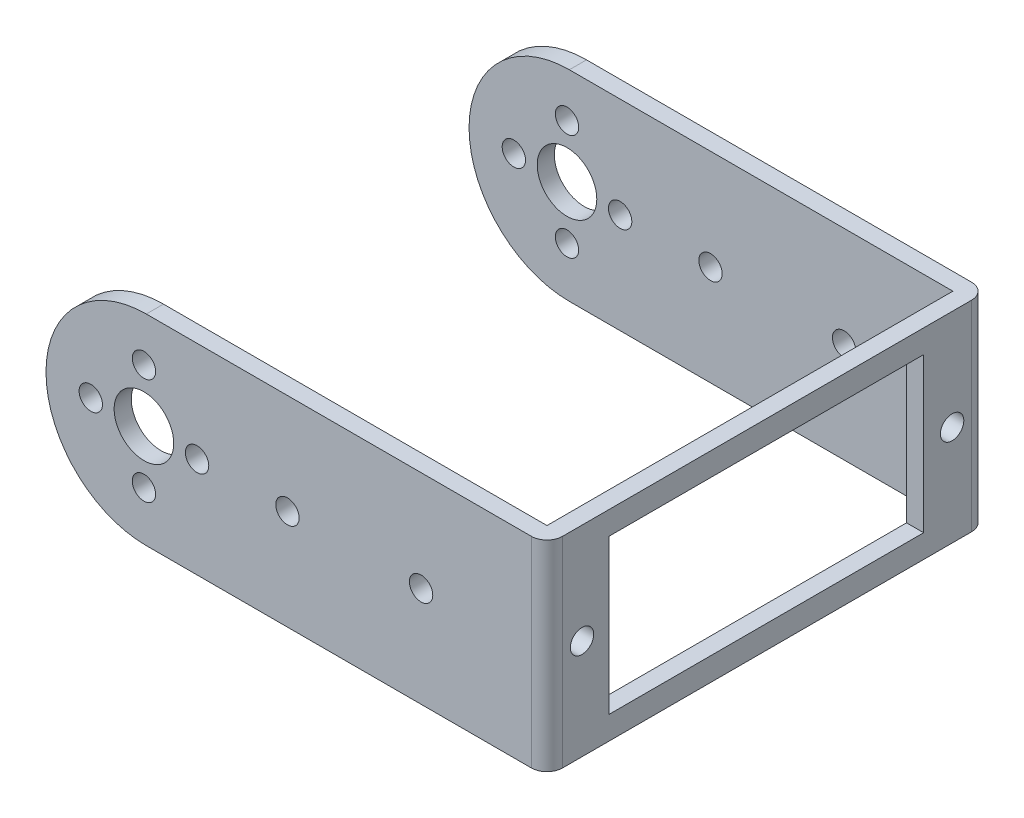
ISO-10303-21;
HEADER;
FILE_DESCRIPTION(('STEP AP214'),'2;1');
FILE_NAME('part.step','',(''),(''),'','','');
FILE_SCHEMA(('AUTOMOTIVE_DESIGN { 1 0 10303 214 1 1 1 1 }'));
ENDSEC;
DATA;
#1=APPLICATION_CONTEXT('core data for automotive mechanical design processes');
#2=APPLICATION_PROTOCOL_DEFINITION('international standard','automotive_design',2000,#1);
#3=PRODUCT_CONTEXT('',#1,'mechanical');
#4=PRODUCT('Part','Part','',(#3));
#5=PRODUCT_RELATED_PRODUCT_CATEGORY('part','',(#4));
#6=PRODUCT_DEFINITION_FORMATION('','',#4);
#7=PRODUCT_DEFINITION_CONTEXT('part definition',#1,'design');
#8=PRODUCT_DEFINITION('design','',#6,#7);
#9=PRODUCT_DEFINITION_SHAPE('','',#8);
#10=(LENGTH_UNIT() NAMED_UNIT(*) SI_UNIT(.MILLI.,.METRE.));
#11=(NAMED_UNIT(*) PLANE_ANGLE_UNIT() SI_UNIT($,.RADIAN.));
#12=(NAMED_UNIT(*) SI_UNIT($,.STERADIAN.) SOLID_ANGLE_UNIT());
#13=UNCERTAINTY_MEASURE_WITH_UNIT(LENGTH_MEASURE(1.E-05),#10,'distance_accuracy_value','');
#14=(GEOMETRIC_REPRESENTATION_CONTEXT(3) GLOBAL_UNCERTAINTY_ASSIGNED_CONTEXT((#13)) GLOBAL_UNIT_ASSIGNED_CONTEXT((#10,
#11,#12)) REPRESENTATION_CONTEXT('',''));
#15=CARTESIAN_POINT('',(0.,0.,0.));
#16=DIRECTION('',(0.,0.,1.));
#17=DIRECTION('',(1.,0.,0.));
#18=AXIS2_PLACEMENT_3D('',#15,#16,#17);
#19=CARTESIAN_POINT('',(62.1,25.75,2.2));
#20=DIRECTION('',(-1.,0.,0.));
#21=DIRECTION('',(0.,0.,1.));
#22=AXIS2_PLACEMENT_3D('',#19,#20,#21);
#23=PLANE('',#22);
#24=CARTESIAN_POINT('',(62.1,12.875,52.));
#25=DIRECTION('',(1.,0.,0.));
#26=DIRECTION('',(0.,0.,-1.));
#27=AXIS2_PLACEMENT_3D('',#24,#25,#26);
#28=CIRCLE('',#27,1.5);
#29=CARTESIAN_POINT('',(62.1,12.875,50.5));
#30=VERTEX_POINT('',#29);
#31=EDGE_CURVE('E838',#30,#30,#28,.T.);
#32=ORIENTED_EDGE('',*,*,#31,.T.);
#33=EDGE_LOOP('',(#32));
#34=FACE_BOUND('',#33,.T.);
#35=CARTESIAN_POINT('',(62.1,12.875,4.5));
#36=DIRECTION('',(1.,0.,0.));
#37=DIRECTION('',(0.,0.,-1.));
#38=AXIS2_PLACEMENT_3D('',#35,#36,#37);
#39=CIRCLE('',#38,1.5);
#40=CARTESIAN_POINT('',(62.1,12.875,3.));
#41=VERTEX_POINT('',#40);
#42=EDGE_CURVE('E847',#41,#41,#39,.T.);
#43=ORIENTED_EDGE('',*,*,#42,.T.);
#44=EDGE_LOOP('',(#43));
#45=FACE_BOUND('',#44,.T.);
#46=DIRECTION('',(0.,1.,0.));
#47=VECTOR('',#46,1.);
#48=CARTESIAN_POINT('',(62.1,19.3125,2.2));
#49=LINE('',#48,#47);
#50=CARTESIAN_POINT('',(62.1,0.,2.2));
#51=VERTEX_POINT('',#50);
#52=CARTESIAN_POINT('',(62.1,25.75,2.2));
#53=VERTEX_POINT('',#52);
#54=EDGE_CURVE('E195',#51,#53,#49,.T.);
#55=ORIENTED_EDGE('',*,*,#54,.F.);
#56=DIRECTION('',(0.,0.,1.));
#57=VECTOR('',#56,1.);
#58=CARTESIAN_POINT('',(62.1,0.,2.2));
#59=LINE('',#58,#57);
#60=CARTESIAN_POINT('',(62.1,0.,54.3));
#61=VERTEX_POINT('',#60);
#62=EDGE_CURVE('E190',#51,#61,#59,.T.);
#63=ORIENTED_EDGE('',*,*,#62,.T.);
#64=DIRECTION('',(0.,-1.,0.));
#65=VECTOR('',#64,1.);
#66=CARTESIAN_POINT('',(62.1,25.75,54.3));
#67=LINE('',#66,#65);
#68=CARTESIAN_POINT('',(62.1,25.75,54.3));
#69=VERTEX_POINT('',#68);
#70=EDGE_CURVE('E307',#69,#61,#67,.T.);
#71=ORIENTED_EDGE('',*,*,#70,.F.);
#72=DIRECTION('',(0.,0.,1.));
#73=VECTOR('',#72,1.);
#74=CARTESIAN_POINT('',(62.1,25.75,2.2));
#75=LINE('',#74,#73);
#76=EDGE_CURVE('E199',#53,#69,#75,.T.);
#77=ORIENTED_EDGE('',*,*,#76,.F.);
#78=EDGE_LOOP('',(#55,#63,#71,#77));
#79=FACE_BOUND('',#78,.T.);
#80=DIRECTION('',(0.,0.,-1.));
#81=VECTOR('',#80,1.);
#82=CARTESIAN_POINT('',(62.1,2.975,48.55));
#83=LINE('',#82,#81);
#84=CARTESIAN_POINT('',(62.1,2.975,48.55));
#85=VERTEX_POINT('',#84);
#86=CARTESIAN_POINT('',(62.1,2.975,8.15));
#87=VERTEX_POINT('',#86);
#88=EDGE_CURVE('E855',#85,#87,#83,.T.);
#89=ORIENTED_EDGE('',*,*,#88,.T.);
#90=DIRECTION('',(0.,-1.,0.));
#91=VECTOR('',#90,1.);
#92=CARTESIAN_POINT('',(62.1,0.,8.15));
#93=LINE('',#92,#91);
#94=CARTESIAN_POINT('',(62.1,22.775,8.15));
#95=VERTEX_POINT('',#94);
#96=EDGE_CURVE('E875',#95,#87,#93,.T.);
#97=ORIENTED_EDGE('',*,*,#96,.F.);
#98=DIRECTION('',(0.,0.,-1.));
#99=VECTOR('',#98,1.);
#100=CARTESIAN_POINT('',(62.1,22.775,48.55));
#101=LINE('',#100,#99);
#102=CARTESIAN_POINT('',(62.1,22.775,48.55));
#103=VERTEX_POINT('',#102);
#104=EDGE_CURVE('E852',#103,#95,#101,.T.);
#105=ORIENTED_EDGE('',*,*,#104,.F.);
#106=DIRECTION('',(0.,-1.,0.));
#107=VECTOR('',#106,1.);
#108=CARTESIAN_POINT('',(62.1,0.,48.55));
#109=LINE('',#108,#107);
#110=EDGE_CURVE('E247',#103,#85,#109,.T.);
#111=ORIENTED_EDGE('',*,*,#110,.T.);
#112=EDGE_LOOP('',(#89,#97,#105,#111));
#113=FACE_BOUND('',#112,.T.);
#114=ADVANCED_FACE('F42',(#34,#45,#79,#113),#23,.T.);
#115=CARTESIAN_POINT('',(64.3,0.,0.));
#116=DIRECTION('',(1.,0.,0.));
#117=DIRECTION('',(0.,1.,0.));
#118=AXIS2_PLACEMENT_3D('',#115,#116,#117);
#119=PLANE('',#118);
#120=CARTESIAN_POINT('',(64.3,12.875,52.));
#121=DIRECTION('',(1.,0.,0.));
#122=DIRECTION('',(0.,0.,-1.));
#123=AXIS2_PLACEMENT_3D('',#120,#121,#122);
#124=CIRCLE('',#123,1.5);
#125=CARTESIAN_POINT('',(64.3,12.875,50.5));
#126=VERTEX_POINT('',#125);
#127=EDGE_CURVE('E841',#126,#126,#124,.T.);
#128=ORIENTED_EDGE('',*,*,#127,.F.);
#129=EDGE_LOOP('',(#128));
#130=FACE_BOUND('',#129,.T.);
#131=CARTESIAN_POINT('',(64.3,12.875,4.5));
#132=DIRECTION('',(1.,0.,0.));
#133=DIRECTION('',(0.,0.,-1.));
#134=AXIS2_PLACEMENT_3D('',#131,#132,#133);
#135=CIRCLE('',#134,1.5);
#136=CARTESIAN_POINT('',(64.3,12.875,3.));
#137=VERTEX_POINT('',#136);
#138=EDGE_CURVE('E842',#137,#137,#135,.T.);
#139=ORIENTED_EDGE('',*,*,#138,.F.);
#140=EDGE_LOOP('',(#139));
#141=FACE_BOUND('',#140,.T.);
#142=DIRECTION('',(0.,1.,0.));
#143=VECTOR('',#142,1.);
#144=CARTESIAN_POINT('',(64.3,6.4375,54.5));
#145=LINE('',#144,#143);
#146=CARTESIAN_POINT('',(64.3,0.,54.5));
#147=VERTEX_POINT('',#146);
#148=CARTESIAN_POINT('',(64.3,25.75,54.5));
#149=VERTEX_POINT('',#148);
#150=EDGE_CURVE('E270',#147,#149,#145,.T.);
#151=ORIENTED_EDGE('',*,*,#150,.F.);
#152=DIRECTION('',(0.,0.,1.));
#153=VECTOR('',#152,1.);
#154=CARTESIAN_POINT('',(64.3,0.,0.));
#155=LINE('',#154,#153);
#156=CARTESIAN_POINT('',(64.3,0.,2.));
#157=VERTEX_POINT('',#156);
#158=EDGE_CURVE('E332',#157,#147,#155,.T.);
#159=ORIENTED_EDGE('',*,*,#158,.F.);
#160=DIRECTION('',(0.,-1.,0.));
#161=VECTOR('',#160,1.);
#162=CARTESIAN_POINT('',(64.3,6.4375,2.));
#163=LINE('',#162,#161);
#164=CARTESIAN_POINT('',(64.3,25.75,2.));
#165=VERTEX_POINT('',#164);
#166=EDGE_CURVE('E284',#165,#157,#163,.T.);
#167=ORIENTED_EDGE('',*,*,#166,.F.);
#168=DIRECTION('',(0.,0.,1.));
#169=VECTOR('',#168,1.);
#170=CARTESIAN_POINT('',(64.3,25.75,0.));
#171=LINE('',#170,#169);
#172=EDGE_CURVE('E273',#165,#149,#171,.T.);
#173=ORIENTED_EDGE('',*,*,#172,.T.);
#174=EDGE_LOOP('',(#151,#159,#167,#173));
#175=FACE_BOUND('',#174,.T.);
#176=DIRECTION('',(0.,0.,-1.));
#177=VECTOR('',#176,1.);
#178=CARTESIAN_POINT('',(64.3,22.775,48.55));
#179=LINE('',#178,#177);
#180=CARTESIAN_POINT('',(64.3,22.775,48.55));
#181=VERTEX_POINT('',#180);
#182=CARTESIAN_POINT('',(64.3,22.775,8.15));
#183=VERTEX_POINT('',#182);
#184=EDGE_CURVE('E844',#181,#183,#179,.T.);
#185=ORIENTED_EDGE('',*,*,#184,.T.);
#186=DIRECTION('',(0.,-1.,0.));
#187=VECTOR('',#186,1.);
#188=CARTESIAN_POINT('',(64.3,0.,8.15));
#189=LINE('',#188,#187);
#190=CARTESIAN_POINT('',(64.3,2.975,8.15));
#191=VERTEX_POINT('',#190);
#192=EDGE_CURVE('E874',#183,#191,#189,.T.);
#193=ORIENTED_EDGE('',*,*,#192,.T.);
#194=DIRECTION('',(0.,0.,-1.));
#195=VECTOR('',#194,1.);
#196=CARTESIAN_POINT('',(64.3,2.975,48.55));
#197=LINE('',#196,#195);
#198=CARTESIAN_POINT('',(64.3,2.975,48.55));
#199=VERTEX_POINT('',#198);
#200=EDGE_CURVE('E856',#199,#191,#197,.T.);
#201=ORIENTED_EDGE('',*,*,#200,.F.);
#202=DIRECTION('',(0.,-1.,0.));
#203=VECTOR('',#202,1.);
#204=CARTESIAN_POINT('',(64.3,0.,48.55));
#205=LINE('',#204,#203);
#206=EDGE_CURVE('E59',#181,#199,#205,.T.);
#207=ORIENTED_EDGE('',*,*,#206,.F.);
#208=EDGE_LOOP('',(#185,#193,#201,#207));
#209=FACE_BOUND('',#208,.T.);
#210=ADVANCED_FACE('F459',(#130,#141,#175,#209),#119,.T.);
#211=CARTESIAN_POINT('',(32.15,12.875,0.));
#212=DIRECTION('',(0.,0.,1.));
#213=DIRECTION('',(1.,0.,0.));
#214=AXIS2_PLACEMENT_3D('',#211,#212,#213);
#215=PLANE('',#214);
#216=CARTESIAN_POINT('',(12.5704196521559,13.1250015369662,0.));
#217=DIRECTION('',(0.,0.,-1.));
#218=DIRECTION('',(-1.,0.,0.));
#219=AXIS2_PLACEMENT_3D('',#216,#217,#218);
#220=CIRCLE('',#219,3.825);
#221=CARTESIAN_POINT('',(16.3954196521559,13.1250015369662,0.));
#222=VERTEX_POINT('',#221);
#223=EDGE_CURVE('E234',#222,#222,#220,.T.);
#224=ORIENTED_EDGE('',*,*,#223,.F.);
#225=EDGE_LOOP('',(#224));
#226=FACE_BOUND('',#225,.T.);
#227=CARTESIAN_POINT('',(12.575,19.95,0.));
#228=DIRECTION('',(0.,0.,-1.));
#229=DIRECTION('',(-1.,0.,0.));
#230=AXIS2_PLACEMENT_3D('',#227,#228,#229);
#231=CIRCLE('',#230,1.5);
#232=CARTESIAN_POINT('',(14.075,19.95,0.));
#233=VERTEX_POINT('',#232);
#234=EDGE_CURVE('E267',#233,#233,#231,.T.);
#235=ORIENTED_EDGE('',*,*,#234,.F.);
#236=EDGE_LOOP('',(#235));
#237=FACE_BOUND('',#236,.T.);
#238=CARTESIAN_POINT('',(5.75,12.875,0.));
#239=DIRECTION('',(0.,0.,-1.));
#240=DIRECTION('',(-1.,0.,0.));
#241=AXIS2_PLACEMENT_3D('',#238,#239,#240);
#242=CIRCLE('',#241,1.5);
#243=CARTESIAN_POINT('',(7.25,12.875,0.));
#244=VERTEX_POINT('',#243);
#245=EDGE_CURVE('E357',#244,#244,#242,.T.);
#246=ORIENTED_EDGE('',*,*,#245,.F.);
#247=EDGE_LOOP('',(#246));
#248=FACE_BOUND('',#247,.T.);
#249=CARTESIAN_POINT('',(12.5704196521559,6.30000153696623,0.));
#250=DIRECTION('',(0.,0.,-1.));
#251=DIRECTION('',(-1.,0.,0.));
#252=AXIS2_PLACEMENT_3D('',#249,#250,#251);
#253=CIRCLE('',#252,1.5);
#254=CARTESIAN_POINT('',(14.0704196521559,6.30000153696623,0.));
#255=VERTEX_POINT('',#254);
#256=EDGE_CURVE('E225',#255,#255,#253,.T.);
#257=ORIENTED_EDGE('',*,*,#256,.F.);
#258=EDGE_LOOP('',(#257));
#259=FACE_BOUND('',#258,.T.);
#260=CARTESIAN_POINT('',(48.1408393043118,12.875,0.));
#261=DIRECTION('',(0.,0.,-1.));
#262=DIRECTION('',(-1.,0.,0.));
#263=AXIS2_PLACEMENT_3D('',#260,#261,#262);
#264=CIRCLE('',#263,1.5);
#265=CARTESIAN_POINT('',(49.6408393043118,12.875,0.));
#266=VERTEX_POINT('',#265);
#267=EDGE_CURVE('E224',#266,#266,#264,.T.);
#268=ORIENTED_EDGE('',*,*,#267,.F.);
#269=EDGE_LOOP('',(#268));
#270=FACE_BOUND('',#269,.T.);
#271=CARTESIAN_POINT('',(30.9908393043118,12.875,0.));
#272=DIRECTION('',(0.,0.,-1.));
#273=DIRECTION('',(-1.,0.,0.));
#274=AXIS2_PLACEMENT_3D('',#271,#272,#273);
#275=CIRCLE('',#274,1.5);
#276=CARTESIAN_POINT('',(32.4908393043118,12.875,0.));
#277=VERTEX_POINT('',#276);
#278=EDGE_CURVE('E324',#277,#277,#275,.T.);
#279=ORIENTED_EDGE('',*,*,#278,.F.);
#280=EDGE_LOOP('',(#279));
#281=FACE_BOUND('',#280,.T.);
#282=CARTESIAN_POINT('',(19.3908393043118,12.875,0.));
#283=DIRECTION('',(0.,0.,-1.));
#284=DIRECTION('',(-1.,0.,0.));
#285=AXIS2_PLACEMENT_3D('',#282,#283,#284);
#286=CIRCLE('',#285,1.5);
#287=CARTESIAN_POINT('',(20.8908393043118,12.875,0.));
#288=VERTEX_POINT('',#287);
#289=EDGE_CURVE('E330',#288,#288,#286,.T.);
#290=ORIENTED_EDGE('',*,*,#289,.F.);
#291=EDGE_LOOP('',(#290));
#292=FACE_BOUND('',#291,.T.);
#293=DIRECTION('',(0.,1.,0.));
#294=VECTOR('',#293,1.);
#295=CARTESIAN_POINT('',(62.3,6.4375,0.));
#296=LINE('',#295,#294);
#297=CARTESIAN_POINT('',(62.3,0.,0.));
#298=VERTEX_POINT('',#297);
#299=CARTESIAN_POINT('',(62.3,25.75,0.));
#300=VERTEX_POINT('',#299);
#301=EDGE_CURVE('E283',#298,#300,#296,.T.);
#302=ORIENTED_EDGE('',*,*,#301,.F.);
#303=DIRECTION('',(1.,0.,0.));
#304=VECTOR('',#303,1.);
#305=CARTESIAN_POINT('',(12.875,0.,0.));
#306=LINE('',#305,#304);
#307=CARTESIAN_POINT('',(12.875,0.,0.));
#308=VERTEX_POINT('',#307);
#309=EDGE_CURVE('E51',#308,#298,#306,.T.);
#310=ORIENTED_EDGE('',*,*,#309,.F.);
#311=CARTESIAN_POINT('',(12.875,12.875,0.));
#312=DIRECTION('',(0.,0.,1.));
#313=DIRECTION('',(0.,1.,0.));
#314=AXIS2_PLACEMENT_3D('',#311,#312,#313);
#315=CIRCLE('',#314,12.875);
#316=CARTESIAN_POINT('',(12.875,25.75,0.));
#317=VERTEX_POINT('',#316);
#318=EDGE_CURVE('E11',#317,#308,#315,.T.);
#319=ORIENTED_EDGE('',*,*,#318,.F.);
#320=DIRECTION('',(-1.,0.,0.));
#321=VECTOR('',#320,1.);
#322=CARTESIAN_POINT('',(64.3,25.75,0.));
#323=LINE('',#322,#321);
#324=EDGE_CURVE('E204',#300,#317,#323,.T.);
#325=ORIENTED_EDGE('',*,*,#324,.F.);
#326=EDGE_LOOP('',(#302,#310,#319,#325));
#327=FACE_BOUND('',#326,.T.);
#328=ADVANCED_FACE('F465',(#226,#237,#248,#259,#270,#281,#292,#327),#215,.F.);
#329=CARTESIAN_POINT('',(12.875,12.875,0.));
#330=DIRECTION('',(0.,0.,1.));
#331=DIRECTION('',(0.,1.,0.));
#332=AXIS2_PLACEMENT_3D('',#329,#330,#331);
#333=CYLINDRICAL_SURFACE('',#332,12.875);
#334=ORIENTED_EDGE('',*,*,#318,.T.);
#335=DIRECTION('',(0.,0.,1.));
#336=VECTOR('',#335,1.);
#337=CARTESIAN_POINT('',(12.875,0.,0.));
#338=LINE('',#337,#336);
#339=CARTESIAN_POINT('',(12.875,0.,2.2));
#340=VERTEX_POINT('',#339);
#341=EDGE_CURVE('E186',#308,#340,#338,.T.);
#342=ORIENTED_EDGE('',*,*,#341,.T.);
#343=CARTESIAN_POINT('',(12.875,12.875,2.2));
#344=DIRECTION('',(0.,0.,1.));
#345=DIRECTION('',(0.,1.,0.));
#346=AXIS2_PLACEMENT_3D('',#343,#344,#345);
#347=CIRCLE('',#346,12.875);
#348=CARTESIAN_POINT('',(12.875,25.75,2.2));
#349=VERTEX_POINT('',#348);
#350=EDGE_CURVE('E46',#349,#340,#347,.T.);
#351=ORIENTED_EDGE('',*,*,#350,.F.);
#352=DIRECTION('',(0.,0.,1.));
#353=VECTOR('',#352,1.);
#354=CARTESIAN_POINT('',(12.875,25.75,0.));
#355=LINE('',#354,#353);
#356=EDGE_CURVE('E183',#317,#349,#355,.T.);
#357=ORIENTED_EDGE('',*,*,#356,.F.);
#358=EDGE_LOOP('',(#334,#342,#351,#357));
#359=FACE_BOUND('',#358,.T.);
#360=ADVANCED_FACE('F181',(#359),#333,.T.);
#361=CARTESIAN_POINT('',(12.875,0.,0.));
#362=DIRECTION('',(0.,-1.,0.));
#363=DIRECTION('',(-1.,0.,0.));
#364=AXIS2_PLACEMENT_3D('',#361,#362,#363);
#365=PLANE('',#364);
#366=CARTESIAN_POINT('',(62.3,0.,54.5));
#367=DIRECTION('',(0.,1.,0.));
#368=DIRECTION('',(0.707106781186548,0.,0.707106781186548));
#369=AXIS2_PLACEMENT_3D('',#366,#367,#368);
#370=CIRCLE('',#369,2.);
#371=CARTESIAN_POINT('',(62.3,0.,56.5));
#372=VERTEX_POINT('',#371);
#373=EDGE_CURVE('E274',#372,#147,#370,.T.);
#374=ORIENTED_EDGE('',*,*,#373,.F.);
#375=DIRECTION('',(1.,0.,0.));
#376=VECTOR('',#375,1.);
#377=CARTESIAN_POINT('',(12.875,0.,56.5));
#378=LINE('',#377,#376);
#379=CARTESIAN_POINT('',(12.875,0.,56.5));
#380=VERTEX_POINT('',#379);
#381=EDGE_CURVE('E226',#380,#372,#378,.T.);
#382=ORIENTED_EDGE('',*,*,#381,.F.);
#383=DIRECTION('',(0.,0.,-1.));
#384=VECTOR('',#383,1.);
#385=CARTESIAN_POINT('',(12.875,0.,56.5));
#386=LINE('',#385,#384);
#387=CARTESIAN_POINT('',(12.875,0.,54.3));
#388=VERTEX_POINT('',#387);
#389=EDGE_CURVE('E260',#380,#388,#386,.T.);
#390=ORIENTED_EDGE('',*,*,#389,.T.);
#391=DIRECTION('',(1.,0.,0.));
#392=VECTOR('',#391,1.);
#393=CARTESIAN_POINT('',(12.875,0.,54.3));
#394=LINE('',#393,#392);
#395=EDGE_CURVE('E228',#388,#61,#394,.T.);
#396=ORIENTED_EDGE('',*,*,#395,.T.);
#397=ORIENTED_EDGE('',*,*,#62,.F.);
#398=DIRECTION('',(1.,0.,0.));
#399=VECTOR('',#398,1.);
#400=CARTESIAN_POINT('',(12.875,0.,2.2));
#401=LINE('',#400,#399);
#402=EDGE_CURVE('E189',#340,#51,#401,.T.);
#403=ORIENTED_EDGE('',*,*,#402,.F.);
#404=ORIENTED_EDGE('',*,*,#341,.F.);
#405=ORIENTED_EDGE('',*,*,#309,.T.);
#406=CARTESIAN_POINT('',(62.3,0.,2.));
#407=DIRECTION('',(0.,1.,0.));
#408=DIRECTION('',(0.707106781186546,0.,-0.707106781186549));
#409=AXIS2_PLACEMENT_3D('',#406,#407,#408);
#410=CIRCLE('',#409,2.);
#411=EDGE_CURVE('E281',#157,#298,#410,.T.);
#412=ORIENTED_EDGE('',*,*,#411,.F.);
#413=ORIENTED_EDGE('',*,*,#158,.T.);
#414=EDGE_LOOP('',(#374,#382,#390,#396,#397,#403,#404,#405,#412,#413));
#415=FACE_BOUND('',#414,.T.);
#416=ADVANCED_FACE('F504',(#415),#365,.T.);
#417=CARTESIAN_POINT('',(19.3908393043118,12.875,0.));
#418=DIRECTION('',(0.,0.,1.));
#419=DIRECTION('',(-1.,0.,0.));
#420=AXIS2_PLACEMENT_3D('',#417,#418,#419);
#421=CYLINDRICAL_SURFACE('',#420,1.5);
#422=CARTESIAN_POINT('',(19.3908393043118,12.875,2.2));
#423=DIRECTION('',(0.,0.,-1.));
#424=DIRECTION('',(-1.,0.,0.));
#425=AXIS2_PLACEMENT_3D('',#422,#423,#424);
#426=CIRCLE('',#425,1.5);
#427=CARTESIAN_POINT('',(20.8908393043118,12.875,2.2));
#428=VERTEX_POINT('',#427);
#429=EDGE_CURVE('E379',#428,#428,#426,.T.);
#430=ORIENTED_EDGE('',*,*,#429,.F.);
#431=DIRECTION('',(0.,0.,-1.));
#432=VECTOR('',#431,1.);
#433=CARTESIAN_POINT('',(20.8908393043118,12.875,0.));
#434=LINE('',#433,#432);
#435=EDGE_CURVE('E327',#428,#288,#434,.T.);
#436=ORIENTED_EDGE('',*,*,#435,.T.);
#437=ORIENTED_EDGE('',*,*,#289,.T.);
#438=ORIENTED_EDGE('',*,*,#435,.F.);
#439=EDGE_LOOP('',(#430,#436,#437,#438));
#440=FACE_BOUND('',#439,.T.);
#441=ADVANCED_FACE('F501',(#440),#421,.F.);
#442=CARTESIAN_POINT('',(30.9908393043118,12.875,0.));
#443=DIRECTION('',(0.,0.,1.));
#444=DIRECTION('',(-1.,0.,0.));
#445=AXIS2_PLACEMENT_3D('',#442,#443,#444);
#446=CYLINDRICAL_SURFACE('',#445,1.5);
#447=CARTESIAN_POINT('',(30.9908393043118,12.875,2.2));
#448=DIRECTION('',(0.,0.,-1.));
#449=DIRECTION('',(-1.,0.,0.));
#450=AXIS2_PLACEMENT_3D('',#447,#448,#449);
#451=CIRCLE('',#450,1.5);
#452=CARTESIAN_POINT('',(32.4908393043118,12.875,2.2));
#453=VERTEX_POINT('',#452);
#454=EDGE_CURVE('E279',#453,#453,#451,.T.);
#455=ORIENTED_EDGE('',*,*,#454,.F.);
#456=DIRECTION('',(0.,0.,-1.));
#457=VECTOR('',#456,1.);
#458=CARTESIAN_POINT('',(32.4908393043118,12.875,0.));
#459=LINE('',#458,#457);
#460=EDGE_CURVE('E322',#453,#277,#459,.T.);
#461=ORIENTED_EDGE('',*,*,#460,.T.);
#462=ORIENTED_EDGE('',*,*,#278,.T.);
#463=ORIENTED_EDGE('',*,*,#460,.F.);
#464=EDGE_LOOP('',(#455,#461,#462,#463));
#465=FACE_BOUND('',#464,.T.);
#466=ADVANCED_FACE('F496',(#465),#446,.F.);
#467=CARTESIAN_POINT('',(48.1408393043118,12.875,0.));
#468=DIRECTION('',(0.,0.,1.));
#469=DIRECTION('',(-1.,0.,0.));
#470=AXIS2_PLACEMENT_3D('',#467,#468,#469);
#471=CYLINDRICAL_SURFACE('',#470,1.5);
#472=CARTESIAN_POINT('',(48.1408393043118,12.875,2.2));
#473=DIRECTION('',(0.,0.,-1.));
#474=DIRECTION('',(-1.,0.,0.));
#475=AXIS2_PLACEMENT_3D('',#472,#473,#474);
#476=CIRCLE('',#475,1.5);
#477=CARTESIAN_POINT('',(49.6408393043118,12.875,2.2));
#478=VERTEX_POINT('',#477);
#479=EDGE_CURVE('E277',#478,#478,#476,.T.);
#480=ORIENTED_EDGE('',*,*,#479,.F.);
#481=DIRECTION('',(0.,0.,-1.));
#482=VECTOR('',#481,1.);
#483=CARTESIAN_POINT('',(49.6408393043118,12.875,0.));
#484=LINE('',#483,#482);
#485=EDGE_CURVE('E221',#478,#266,#484,.T.);
#486=ORIENTED_EDGE('',*,*,#485,.T.);
#487=ORIENTED_EDGE('',*,*,#267,.T.);
#488=ORIENTED_EDGE('',*,*,#485,.F.);
#489=EDGE_LOOP('',(#480,#486,#487,#488));
#490=FACE_BOUND('',#489,.T.);
#491=ADVANCED_FACE('F493',(#490),#471,.F.);
#492=CARTESIAN_POINT('',(12.5704196521559,6.30000153696623,0.));
#493=DIRECTION('',(0.,0.,1.));
#494=DIRECTION('',(-1.,0.,0.));
#495=AXIS2_PLACEMENT_3D('',#492,#493,#494);
#496=CYLINDRICAL_SURFACE('',#495,1.5);
#497=CARTESIAN_POINT('',(12.5704196521559,6.30000153696623,2.2));
#498=DIRECTION('',(0.,0.,-1.));
#499=DIRECTION('',(-1.,0.,0.));
#500=AXIS2_PLACEMENT_3D('',#497,#498,#499);
#501=CIRCLE('',#500,1.5);
#502=CARTESIAN_POINT('',(14.0704196521559,6.30000153696623,2.2));
#503=VERTEX_POINT('',#502);
#504=EDGE_CURVE('E210',#503,#503,#501,.T.);
#505=ORIENTED_EDGE('',*,*,#504,.F.);
#506=DIRECTION('',(0.,0.,-1.));
#507=VECTOR('',#506,1.);
#508=CARTESIAN_POINT('',(14.0704196521559,6.30000153696623,0.));
#509=LINE('',#508,#507);
#510=EDGE_CURVE('E320',#503,#255,#509,.T.);
#511=ORIENTED_EDGE('',*,*,#510,.T.);
#512=ORIENTED_EDGE('',*,*,#256,.T.);
#513=ORIENTED_EDGE('',*,*,#510,.F.);
#514=EDGE_LOOP('',(#505,#511,#512,#513));
#515=FACE_BOUND('',#514,.T.);
#516=ADVANCED_FACE('F392',(#515),#496,.F.);
#517=CARTESIAN_POINT('',(5.75,12.875,0.));
#518=DIRECTION('',(0.,0.,1.));
#519=DIRECTION('',(-1.,0.,0.));
#520=AXIS2_PLACEMENT_3D('',#517,#518,#519);
#521=CYLINDRICAL_SURFACE('',#520,1.5);
#522=CARTESIAN_POINT('',(5.75,12.875,2.2));
#523=DIRECTION('',(0.,0.,-1.));
#524=DIRECTION('',(-1.,0.,0.));
#525=AXIS2_PLACEMENT_3D('',#522,#523,#524);
#526=CIRCLE('',#525,1.5);
#527=CARTESIAN_POINT('',(7.25,12.875,2.2));
#528=VERTEX_POINT('',#527);
#529=EDGE_CURVE('E232',#528,#528,#526,.T.);
#530=ORIENTED_EDGE('',*,*,#529,.F.);
#531=DIRECTION('',(0.,0.,-1.));
#532=VECTOR('',#531,1.);
#533=CARTESIAN_POINT('',(7.25,12.875,0.));
#534=LINE('',#533,#532);
#535=EDGE_CURVE('E269',#528,#244,#534,.T.);
#536=ORIENTED_EDGE('',*,*,#535,.T.);
#537=ORIENTED_EDGE('',*,*,#245,.T.);
#538=ORIENTED_EDGE('',*,*,#535,.F.);
#539=EDGE_LOOP('',(#530,#536,#537,#538));
#540=FACE_BOUND('',#539,.T.);
#541=ADVANCED_FACE('F492',(#540),#521,.F.);
#542=CARTESIAN_POINT('',(12.575,19.95,0.));
#543=DIRECTION('',(0.,0.,1.));
#544=DIRECTION('',(-1.,0.,0.));
#545=AXIS2_PLACEMENT_3D('',#542,#543,#544);
#546=CYLINDRICAL_SURFACE('',#545,1.5);
#547=CARTESIAN_POINT('',(12.575,19.95,2.2));
#548=DIRECTION('',(0.,0.,-1.));
#549=DIRECTION('',(-1.,0.,0.));
#550=AXIS2_PLACEMENT_3D('',#547,#548,#549);
#551=CIRCLE('',#550,1.5);
#552=CARTESIAN_POINT('',(14.075,19.95,2.2));
#553=VERTEX_POINT('',#552);
#554=EDGE_CURVE('E229',#553,#553,#551,.T.);
#555=ORIENTED_EDGE('',*,*,#554,.F.);
#556=DIRECTION('',(0.,0.,-1.));
#557=VECTOR('',#556,1.);
#558=CARTESIAN_POINT('',(14.075,19.95,0.));
#559=LINE('',#558,#557);
#560=EDGE_CURVE('E236',#553,#233,#559,.T.);
#561=ORIENTED_EDGE('',*,*,#560,.T.);
#562=ORIENTED_EDGE('',*,*,#234,.T.);
#563=ORIENTED_EDGE('',*,*,#560,.F.);
#564=EDGE_LOOP('',(#555,#561,#562,#563));
#565=FACE_BOUND('',#564,.T.);
#566=ADVANCED_FACE('F480',(#565),#546,.F.);
#567=CARTESIAN_POINT('',(12.5704196521559,13.1250015369662,0.));
#568=DIRECTION('',(0.,0.,1.));
#569=DIRECTION('',(-1.,0.,0.));
#570=AXIS2_PLACEMENT_3D('',#567,#568,#569);
#571=CYLINDRICAL_SURFACE('',#570,3.825);
#572=CARTESIAN_POINT('',(12.5704196521559,13.1250015369662,2.2));
#573=DIRECTION('',(0.,0.,-1.));
#574=DIRECTION('',(-1.,0.,0.));
#575=AXIS2_PLACEMENT_3D('',#572,#573,#574);
#576=CIRCLE('',#575,3.825);
#577=CARTESIAN_POINT('',(16.3954196521559,13.1250015369662,2.2));
#578=VERTEX_POINT('',#577);
#579=EDGE_CURVE('E233',#578,#578,#576,.T.);
#580=ORIENTED_EDGE('',*,*,#579,.F.);
#581=DIRECTION('',(0.,0.,-1.));
#582=VECTOR('',#581,1.);
#583=CARTESIAN_POINT('',(16.3954196521559,13.1250015369662,0.));
#584=LINE('',#583,#582);
#585=EDGE_CURVE('E237',#578,#222,#584,.T.);
#586=ORIENTED_EDGE('',*,*,#585,.T.);
#587=ORIENTED_EDGE('',*,*,#223,.T.);
#588=ORIENTED_EDGE('',*,*,#585,.F.);
#589=EDGE_LOOP('',(#580,#586,#587,#588));
#590=FACE_BOUND('',#589,.T.);
#591=ADVANCED_FACE('F477',(#590),#571,.F.);
#592=CARTESIAN_POINT('',(32.15,12.875,2.2));
#593=DIRECTION('',(0.,0.,1.));
#594=DIRECTION('',(1.,0.,0.));
#595=AXIS2_PLACEMENT_3D('',#592,#593,#594);
#596=PLANE('',#595);
#597=ORIENTED_EDGE('',*,*,#429,.T.);
#598=EDGE_LOOP('',(#597));
#599=FACE_BOUND('',#598,.T.);
#600=ORIENTED_EDGE('',*,*,#454,.T.);
#601=EDGE_LOOP('',(#600));
#602=FACE_BOUND('',#601,.T.);
#603=ORIENTED_EDGE('',*,*,#479,.T.);
#604=EDGE_LOOP('',(#603));
#605=FACE_BOUND('',#604,.T.);
#606=ORIENTED_EDGE('',*,*,#504,.T.);
#607=EDGE_LOOP('',(#606));
#608=FACE_BOUND('',#607,.T.);
#609=ORIENTED_EDGE('',*,*,#529,.T.);
#610=EDGE_LOOP('',(#609));
#611=FACE_BOUND('',#610,.T.);
#612=ORIENTED_EDGE('',*,*,#554,.T.);
#613=EDGE_LOOP('',(#612));
#614=FACE_BOUND('',#613,.T.);
#615=ORIENTED_EDGE('',*,*,#579,.T.);
#616=EDGE_LOOP('',(#615));
#617=FACE_BOUND('',#616,.T.);
#618=ORIENTED_EDGE('',*,*,#54,.T.);
#619=DIRECTION('',(-1.,0.,0.));
#620=VECTOR('',#619,1.);
#621=CARTESIAN_POINT('',(64.3,25.75,2.2));
#622=LINE('',#621,#620);
#623=EDGE_CURVE('E192',#53,#349,#622,.T.);
#624=ORIENTED_EDGE('',*,*,#623,.T.);
#625=ORIENTED_EDGE('',*,*,#350,.T.);
#626=ORIENTED_EDGE('',*,*,#402,.T.);
#627=EDGE_LOOP('',(#618,#624,#625,#626));
#628=FACE_BOUND('',#627,.T.);
#629=ADVANCED_FACE('F193',(#599,#602,#605,#608,#611,#614,#617,#628),#596,.T.);
#630=CARTESIAN_POINT('',(32.15,12.875,56.5));
#631=DIRECTION('',(0.,0.,1.));
#632=DIRECTION('',(1.,0.,0.));
#633=AXIS2_PLACEMENT_3D('',#630,#631,#632);
#634=PLANE('',#633);
#635=CARTESIAN_POINT('',(12.5704196521559,13.1250015369662,56.5));
#636=DIRECTION('',(0.,0.,-1.));
#637=DIRECTION('',(-1.,0.,0.));
#638=AXIS2_PLACEMENT_3D('',#635,#636,#637);
#639=CIRCLE('',#638,3.825);
#640=CARTESIAN_POINT('',(16.3954196521559,13.1250015369662,56.5));
#641=VERTEX_POINT('',#640);
#642=EDGE_CURVE('E403',#641,#641,#639,.T.);
#643=ORIENTED_EDGE('',*,*,#642,.T.);
#644=EDGE_LOOP('',(#643));
#645=FACE_BOUND('',#644,.T.);
#646=CARTESIAN_POINT('',(12.575,19.95,56.5));
#647=DIRECTION('',(0.,0.,-1.));
#648=DIRECTION('',(-1.,0.,0.));
#649=AXIS2_PLACEMENT_3D('',#646,#647,#648);
#650=CIRCLE('',#649,1.5);
#651=CARTESIAN_POINT('',(14.075,19.95,56.5));
#652=VERTEX_POINT('',#651);
#653=EDGE_CURVE('E217',#652,#652,#650,.T.);
#654=ORIENTED_EDGE('',*,*,#653,.T.);
#655=EDGE_LOOP('',(#654));
#656=FACE_BOUND('',#655,.T.);
#657=CARTESIAN_POINT('',(5.75,12.875,56.5));
#658=DIRECTION('',(0.,0.,-1.));
#659=DIRECTION('',(-1.,0.,0.));
#660=AXIS2_PLACEMENT_3D('',#657,#658,#659);
#661=CIRCLE('',#660,1.5);
#662=CARTESIAN_POINT('',(7.25,12.875,56.5));
#663=VERTEX_POINT('',#662);
#664=EDGE_CURVE('E266',#663,#663,#661,.T.);
#665=ORIENTED_EDGE('',*,*,#664,.T.);
#666=EDGE_LOOP('',(#665));
#667=FACE_BOUND('',#666,.T.);
#668=CARTESIAN_POINT('',(12.5704196521559,6.30000153696623,56.5));
#669=DIRECTION('',(0.,0.,-1.));
#670=DIRECTION('',(-1.,0.,0.));
#671=AXIS2_PLACEMENT_3D('',#668,#669,#670);
#672=CIRCLE('',#671,1.5);
#673=CARTESIAN_POINT('',(14.0704196521559,6.30000153696623,56.5));
#674=VERTEX_POINT('',#673);
#675=EDGE_CURVE('E215',#674,#674,#672,.T.);
#676=ORIENTED_EDGE('',*,*,#675,.T.);
#677=EDGE_LOOP('',(#676));
#678=FACE_BOUND('',#677,.T.);
#679=CARTESIAN_POINT('',(48.1408393043118,12.875,56.5));
#680=DIRECTION('',(0.,0.,-1.));
#681=DIRECTION('',(-1.,0.,0.));
#682=AXIS2_PLACEMENT_3D('',#679,#680,#681);
#683=CIRCLE('',#682,1.5);
#684=CARTESIAN_POINT('',(49.6408393043118,12.875,56.5));
#685=VERTEX_POINT('',#684);
#686=EDGE_CURVE('E251',#685,#685,#683,.T.);
#687=ORIENTED_EDGE('',*,*,#686,.T.);
#688=EDGE_LOOP('',(#687));
#689=FACE_BOUND('',#688,.T.);
#690=CARTESIAN_POINT('',(30.9908393043118,12.875,56.5));
#691=DIRECTION('',(0.,0.,-1.));
#692=DIRECTION('',(-1.,0.,0.));
#693=AXIS2_PLACEMENT_3D('',#690,#691,#692);
#694=CIRCLE('',#693,1.5);
#695=CARTESIAN_POINT('',(32.4908393043118,12.875,56.5));
#696=VERTEX_POINT('',#695);
#697=EDGE_CURVE('E242',#696,#696,#694,.T.);
#698=ORIENTED_EDGE('',*,*,#697,.T.);
#699=EDGE_LOOP('',(#698));
#700=FACE_BOUND('',#699,.T.);
#701=CARTESIAN_POINT('',(19.3908393043118,12.875,56.5));
#702=DIRECTION('',(0.,0.,-1.));
#703=DIRECTION('',(-1.,0.,0.));
#704=AXIS2_PLACEMENT_3D('',#701,#702,#703);
#705=CIRCLE('',#704,1.5);
#706=CARTESIAN_POINT('',(20.8908393043118,12.875,56.5));
#707=VERTEX_POINT('',#706);
#708=EDGE_CURVE('E317',#707,#707,#705,.T.);
#709=ORIENTED_EDGE('',*,*,#708,.T.);
#710=EDGE_LOOP('',(#709));
#711=FACE_BOUND('',#710,.T.);
#712=DIRECTION('',(0.,-1.,0.));
#713=VECTOR('',#712,1.);
#714=CARTESIAN_POINT('',(62.3,6.4375,56.5));
#715=LINE('',#714,#713);
#716=CARTESIAN_POINT('',(62.3,25.75,56.5));
#717=VERTEX_POINT('',#716);
#718=EDGE_CURVE('E246',#717,#372,#715,.T.);
#719=ORIENTED_EDGE('',*,*,#718,.F.);
#720=DIRECTION('',(-1.,0.,0.));
#721=VECTOR('',#720,1.);
#722=CARTESIAN_POINT('',(64.3,25.75,56.5));
#723=LINE('',#722,#721);
#724=CARTESIAN_POINT('',(12.875,25.75,56.5));
#725=VERTEX_POINT('',#724);
#726=EDGE_CURVE('E338',#717,#725,#723,.T.);
#727=ORIENTED_EDGE('',*,*,#726,.T.);
#728=CARTESIAN_POINT('',(12.875,12.875,56.5));
#729=DIRECTION('',(0.,0.,1.));
#730=DIRECTION('',(0.,1.,0.));
#731=AXIS2_PLACEMENT_3D('',#728,#729,#730);
#732=CIRCLE('',#731,12.875);
#733=EDGE_CURVE('E261',#725,#380,#732,.T.);
#734=ORIENTED_EDGE('',*,*,#733,.T.);
#735=ORIENTED_EDGE('',*,*,#381,.T.);
#736=EDGE_LOOP('',(#719,#727,#734,#735));
#737=FACE_BOUND('',#736,.T.);
#738=ADVANCED_FACE('F295',(#645,#656,#667,#678,#689,#700,#711,#737),#634,.T.);
#739=CARTESIAN_POINT('',(32.15,12.875,54.3));
#740=DIRECTION('',(0.,0.,1.));
#741=DIRECTION('',(1.,0.,0.));
#742=AXIS2_PLACEMENT_3D('',#739,#740,#741);
#743=PLANE('',#742);
#744=CARTESIAN_POINT('',(12.5704196521559,13.1250015369662,54.3));
#745=DIRECTION('',(0.,0.,-1.));
#746=DIRECTION('',(-1.,0.,0.));
#747=AXIS2_PLACEMENT_3D('',#744,#745,#746);
#748=CIRCLE('',#747,3.825);
#749=CARTESIAN_POINT('',(16.3954196521559,13.1250015369662,54.3));
#750=VERTEX_POINT('',#749);
#751=EDGE_CURVE('E354',#750,#750,#748,.T.);
#752=ORIENTED_EDGE('',*,*,#751,.F.);
#753=EDGE_LOOP('',(#752));
#754=FACE_BOUND('',#753,.T.);
#755=CARTESIAN_POINT('',(12.575,19.95,54.3));
#756=DIRECTION('',(0.,0.,-1.));
#757=DIRECTION('',(-1.,0.,0.));
#758=AXIS2_PLACEMENT_3D('',#755,#756,#757);
#759=CIRCLE('',#758,1.5);
#760=CARTESIAN_POINT('',(14.075,19.95,54.3));
#761=VERTEX_POINT('',#760);
#762=EDGE_CURVE('E375',#761,#761,#759,.T.);
#763=ORIENTED_EDGE('',*,*,#762,.F.);
#764=EDGE_LOOP('',(#763));
#765=FACE_BOUND('',#764,.T.);
#766=CARTESIAN_POINT('',(5.75,12.875,54.3));
#767=DIRECTION('',(0.,0.,-1.));
#768=DIRECTION('',(-1.,0.,0.));
#769=AXIS2_PLACEMENT_3D('',#766,#767,#768);
#770=CIRCLE('',#769,1.5);
#771=CARTESIAN_POINT('',(7.25,12.875,54.3));
#772=VERTEX_POINT('',#771);
#773=EDGE_CURVE('E219',#772,#772,#770,.T.);
#774=ORIENTED_EDGE('',*,*,#773,.F.);
#775=EDGE_LOOP('',(#774));
#776=FACE_BOUND('',#775,.T.);
#777=CARTESIAN_POINT('',(12.5704196521559,6.30000153696623,54.3));
#778=DIRECTION('',(0.,0.,-1.));
#779=DIRECTION('',(-1.,0.,0.));
#780=AXIS2_PLACEMENT_3D('',#777,#778,#779);
#781=CIRCLE('',#780,1.5);
#782=CARTESIAN_POINT('',(14.0704196521559,6.30000153696623,54.3));
#783=VERTEX_POINT('',#782);
#784=EDGE_CURVE('E216',#783,#783,#781,.T.);
#785=ORIENTED_EDGE('',*,*,#784,.F.);
#786=EDGE_LOOP('',(#785));
#787=FACE_BOUND('',#786,.T.);
#788=CARTESIAN_POINT('',(48.1408393043118,12.875,54.3));
#789=DIRECTION('',(0.,0.,-1.));
#790=DIRECTION('',(-1.,0.,0.));
#791=AXIS2_PLACEMENT_3D('',#788,#789,#790);
#792=CIRCLE('',#791,1.5);
#793=CARTESIAN_POINT('',(49.6408393043118,12.875,54.3));
#794=VERTEX_POINT('',#793);
#795=EDGE_CURVE('E252',#794,#794,#792,.T.);
#796=ORIENTED_EDGE('',*,*,#795,.F.);
#797=EDGE_LOOP('',(#796));
#798=FACE_BOUND('',#797,.T.);
#799=CARTESIAN_POINT('',(30.9908393043118,12.875,54.3));
#800=DIRECTION('',(0.,0.,-1.));
#801=DIRECTION('',(-1.,0.,0.));
#802=AXIS2_PLACEMENT_3D('',#799,#800,#801);
#803=CIRCLE('',#802,1.5);
#804=CARTESIAN_POINT('',(32.4908393043118,12.875,54.3));
#805=VERTEX_POINT('',#804);
#806=EDGE_CURVE('E301',#805,#805,#803,.T.);
#807=ORIENTED_EDGE('',*,*,#806,.F.);
#808=EDGE_LOOP('',(#807));
#809=FACE_BOUND('',#808,.T.);
#810=CARTESIAN_POINT('',(19.3908393043118,12.875,54.3));
#811=DIRECTION('',(0.,0.,-1.));
#812=DIRECTION('',(-1.,0.,0.));
#813=AXIS2_PLACEMENT_3D('',#810,#811,#812);
#814=CIRCLE('',#813,1.5);
#815=CARTESIAN_POINT('',(20.8908393043118,12.875,54.3));
#816=VERTEX_POINT('',#815);
#817=EDGE_CURVE('E238',#816,#816,#814,.T.);
#818=ORIENTED_EDGE('',*,*,#817,.F.);
#819=EDGE_LOOP('',(#818));
#820=FACE_BOUND('',#819,.T.);
#821=ORIENTED_EDGE('',*,*,#70,.T.);
#822=ORIENTED_EDGE('',*,*,#395,.F.);
#823=CARTESIAN_POINT('',(12.875,12.875,54.3));
#824=DIRECTION('',(0.,0.,1.));
#825=DIRECTION('',(0.,1.,0.));
#826=AXIS2_PLACEMENT_3D('',#823,#824,#825);
#827=CIRCLE('',#826,12.875);
#828=CARTESIAN_POINT('',(12.875,25.75,54.3));
#829=VERTEX_POINT('',#828);
#830=EDGE_CURVE('E257',#829,#388,#827,.T.);
#831=ORIENTED_EDGE('',*,*,#830,.F.);
#832=DIRECTION('',(-1.,0.,0.));
#833=VECTOR('',#832,1.);
#834=CARTESIAN_POINT('',(64.3,25.75,54.3));
#835=LINE('',#834,#833);
#836=EDGE_CURVE('E253',#69,#829,#835,.T.);
#837=ORIENTED_EDGE('',*,*,#836,.F.);
#838=EDGE_LOOP('',(#821,#822,#831,#837));
#839=FACE_BOUND('',#838,.T.);
#840=ADVANCED_FACE('F291',(#754,#765,#776,#787,#798,#809,#820,#839),#743,.F.);
#841=CARTESIAN_POINT('',(12.875,12.875,56.5));
#842=DIRECTION('',(0.,0.,1.));
#843=DIRECTION('',(0.,1.,0.));
#844=AXIS2_PLACEMENT_3D('',#841,#842,#843);
#845=CYLINDRICAL_SURFACE('',#844,12.875);
#846=ORIENTED_EDGE('',*,*,#733,.F.);
#847=DIRECTION('',(0.,0.,-1.));
#848=VECTOR('',#847,1.);
#849=CARTESIAN_POINT('',(12.875,25.75,56.5));
#850=LINE('',#849,#848);
#851=EDGE_CURVE('E256',#725,#829,#850,.T.);
#852=ORIENTED_EDGE('',*,*,#851,.T.);
#853=ORIENTED_EDGE('',*,*,#830,.T.);
#854=ORIENTED_EDGE('',*,*,#389,.F.);
#855=EDGE_LOOP('',(#846,#852,#853,#854));
#856=FACE_BOUND('',#855,.T.);
#857=ADVANCED_FACE('F294',(#856),#845,.T.);
#858=CARTESIAN_POINT('',(19.3908393043118,12.875,56.5));
#859=DIRECTION('',(0.,0.,1.));
#860=DIRECTION('',(-1.,0.,0.));
#861=AXIS2_PLACEMENT_3D('',#858,#859,#860);
#862=CYLINDRICAL_SURFACE('',#861,1.5);
#863=ORIENTED_EDGE('',*,*,#817,.T.);
#864=DIRECTION('',(0.,0.,1.));
#865=VECTOR('',#864,1.);
#866=CARTESIAN_POINT('',(20.8908393043118,12.875,56.5));
#867=LINE('',#866,#865);
#868=EDGE_CURVE('E241',#816,#707,#867,.T.);
#869=ORIENTED_EDGE('',*,*,#868,.T.);
#870=ORIENTED_EDGE('',*,*,#708,.F.);
#871=ORIENTED_EDGE('',*,*,#868,.F.);
#872=EDGE_LOOP('',(#863,#869,#870,#871));
#873=FACE_BOUND('',#872,.T.);
#874=ADVANCED_FACE('F447',(#873),#862,.F.);
#875=CARTESIAN_POINT('',(30.9908393043118,12.875,56.5));
#876=DIRECTION('',(0.,0.,1.));
#877=DIRECTION('',(-1.,0.,0.));
#878=AXIS2_PLACEMENT_3D('',#875,#876,#877);
#879=CYLINDRICAL_SURFACE('',#878,1.5);
#880=ORIENTED_EDGE('',*,*,#806,.T.);
#881=DIRECTION('',(0.,0.,1.));
#882=VECTOR('',#881,1.);
#883=CARTESIAN_POINT('',(32.4908393043118,12.875,56.5));
#884=LINE('',#883,#882);
#885=EDGE_CURVE('E335',#805,#696,#884,.T.);
#886=ORIENTED_EDGE('',*,*,#885,.T.);
#887=ORIENTED_EDGE('',*,*,#697,.F.);
#888=ORIENTED_EDGE('',*,*,#885,.F.);
#889=EDGE_LOOP('',(#880,#886,#887,#888));
#890=FACE_BOUND('',#889,.T.);
#891=ADVANCED_FACE('F423',(#890),#879,.F.);
#892=CARTESIAN_POINT('',(48.1408393043118,12.875,56.5));
#893=DIRECTION('',(0.,0.,1.));
#894=DIRECTION('',(-1.,0.,0.));
#895=AXIS2_PLACEMENT_3D('',#892,#893,#894);
#896=CYLINDRICAL_SURFACE('',#895,1.5);
#897=ORIENTED_EDGE('',*,*,#795,.T.);
#898=DIRECTION('',(0.,0.,1.));
#899=VECTOR('',#898,1.);
#900=CARTESIAN_POINT('',(49.6408393043118,12.875,56.5));
#901=LINE('',#900,#899);
#902=EDGE_CURVE('E248',#794,#685,#901,.T.);
#903=ORIENTED_EDGE('',*,*,#902,.T.);
#904=ORIENTED_EDGE('',*,*,#686,.F.);
#905=ORIENTED_EDGE('',*,*,#902,.F.);
#906=EDGE_LOOP('',(#897,#903,#904,#905));
#907=FACE_BOUND('',#906,.T.);
#908=ADVANCED_FACE('F288',(#907),#896,.F.);
#909=CARTESIAN_POINT('',(12.5704196521559,6.30000153696623,56.5));
#910=DIRECTION('',(0.,0.,1.));
#911=DIRECTION('',(-1.,0.,0.));
#912=AXIS2_PLACEMENT_3D('',#909,#910,#911);
#913=CYLINDRICAL_SURFACE('',#912,1.5);
#914=ORIENTED_EDGE('',*,*,#784,.T.);
#915=DIRECTION('',(0.,0.,1.));
#916=VECTOR('',#915,1.);
#917=CARTESIAN_POINT('',(14.0704196521559,6.30000153696623,56.5));
#918=LINE('',#917,#916);
#919=EDGE_CURVE('E212',#783,#674,#918,.T.);
#920=ORIENTED_EDGE('',*,*,#919,.T.);
#921=ORIENTED_EDGE('',*,*,#675,.F.);
#922=ORIENTED_EDGE('',*,*,#919,.F.);
#923=EDGE_LOOP('',(#914,#920,#921,#922));
#924=FACE_BOUND('',#923,.T.);
#925=ADVANCED_FACE('F44',(#924),#913,.F.);
#926=CARTESIAN_POINT('',(5.75,12.875,56.5));
#927=DIRECTION('',(0.,0.,1.));
#928=DIRECTION('',(-1.,0.,0.));
#929=AXIS2_PLACEMENT_3D('',#926,#927,#928);
#930=CYLINDRICAL_SURFACE('',#929,1.5);
#931=ORIENTED_EDGE('',*,*,#773,.T.);
#932=DIRECTION('',(0.,0.,1.));
#933=VECTOR('',#932,1.);
#934=CARTESIAN_POINT('',(7.25,12.875,56.5));
#935=LINE('',#934,#933);
#936=EDGE_CURVE('E346',#772,#663,#935,.T.);
#937=ORIENTED_EDGE('',*,*,#936,.T.);
#938=ORIENTED_EDGE('',*,*,#664,.F.);
#939=ORIENTED_EDGE('',*,*,#936,.F.);
#940=EDGE_LOOP('',(#931,#937,#938,#939));
#941=FACE_BOUND('',#940,.T.);
#942=ADVANCED_FACE('F472',(#941),#930,.F.);
#943=CARTESIAN_POINT('',(12.575,19.95,56.5));
#944=DIRECTION('',(0.,0.,1.));
#945=DIRECTION('',(-1.,0.,0.));
#946=AXIS2_PLACEMENT_3D('',#943,#944,#945);
#947=CYLINDRICAL_SURFACE('',#946,1.5);
#948=ORIENTED_EDGE('',*,*,#762,.T.);
#949=DIRECTION('',(0.,0.,1.));
#950=VECTOR('',#949,1.);
#951=CARTESIAN_POINT('',(14.075,19.95,56.5));
#952=LINE('',#951,#950);
#953=EDGE_CURVE('E220',#761,#652,#952,.T.);
#954=ORIENTED_EDGE('',*,*,#953,.T.);
#955=ORIENTED_EDGE('',*,*,#653,.F.);
#956=ORIENTED_EDGE('',*,*,#953,.F.);
#957=EDGE_LOOP('',(#948,#954,#955,#956));
#958=FACE_BOUND('',#957,.T.);
#959=ADVANCED_FACE('F475',(#958),#947,.F.);
#960=CARTESIAN_POINT('',(12.5704196521559,13.1250015369662,56.5));
#961=DIRECTION('',(0.,0.,1.));
#962=DIRECTION('',(-1.,0.,0.));
#963=AXIS2_PLACEMENT_3D('',#960,#961,#962);
#964=CYLINDRICAL_SURFACE('',#963,3.825);
#965=ORIENTED_EDGE('',*,*,#751,.T.);
#966=DIRECTION('',(0.,0.,1.));
#967=VECTOR('',#966,1.);
#968=CARTESIAN_POINT('',(16.3954196521559,13.1250015369662,56.5));
#969=LINE('',#968,#967);
#970=EDGE_CURVE('E404',#750,#641,#969,.T.);
#971=ORIENTED_EDGE('',*,*,#970,.T.);
#972=ORIENTED_EDGE('',*,*,#642,.F.);
#973=ORIENTED_EDGE('',*,*,#970,.F.);
#974=EDGE_LOOP('',(#965,#971,#972,#973));
#975=FACE_BOUND('',#974,.T.);
#976=ADVANCED_FACE('F576',(#975),#964,.F.);
#977=CARTESIAN_POINT('',(62.3,6.4375,2.));
#978=DIRECTION('',(0.,1.,0.));
#979=DIRECTION('',(0.707106781186546,0.,-0.707106781186549));
#980=AXIS2_PLACEMENT_3D('',#977,#978,#979);
#981=CYLINDRICAL_SURFACE('',#980,2.);
#982=CARTESIAN_POINT('',(62.3,25.75,2.));
#983=DIRECTION('',(0.,-1.,0.));
#984=DIRECTION('',(0.707106781186546,0.,-0.707106781186549));
#985=AXIS2_PLACEMENT_3D('',#982,#983,#984);
#986=CIRCLE('',#985,2.);
#987=EDGE_CURVE('E206',#300,#165,#986,.T.);
#988=ORIENTED_EDGE('',*,*,#987,.T.);
#989=ORIENTED_EDGE('',*,*,#166,.T.);
#990=ORIENTED_EDGE('',*,*,#411,.T.);
#991=ORIENTED_EDGE('',*,*,#301,.T.);
#992=EDGE_LOOP('',(#988,#989,#990,#991));
#993=FACE_BOUND('',#992,.T.);
#994=ADVANCED_FACE('F484',(#993),#981,.T.);
#995=CARTESIAN_POINT('',(64.3,25.75,0.));
#996=DIRECTION('',(0.,1.,0.));
#997=DIRECTION('',(1.,0.,0.));
#998=AXIS2_PLACEMENT_3D('',#995,#996,#997);
#999=PLANE('',#998);
#1000=CARTESIAN_POINT('',(62.3,25.75,54.5));
#1001=DIRECTION('',(0.,-1.,0.));
#1002=DIRECTION('',(0.707106781186548,0.,0.707106781186548));
#1003=AXIS2_PLACEMENT_3D('',#1000,#1001,#1002);
#1004=CIRCLE('',#1003,2.);
#1005=EDGE_CURVE('E243',#149,#717,#1004,.T.);
#1006=ORIENTED_EDGE('',*,*,#1005,.F.);
#1007=ORIENTED_EDGE('',*,*,#172,.F.);
#1008=ORIENTED_EDGE('',*,*,#987,.F.);
#1009=ORIENTED_EDGE('',*,*,#324,.T.);
#1010=ORIENTED_EDGE('',*,*,#356,.T.);
#1011=ORIENTED_EDGE('',*,*,#623,.F.);
#1012=ORIENTED_EDGE('',*,*,#76,.T.);
#1013=ORIENTED_EDGE('',*,*,#836,.T.);
#1014=ORIENTED_EDGE('',*,*,#851,.F.);
#1015=ORIENTED_EDGE('',*,*,#726,.F.);
#1016=EDGE_LOOP('',(#1006,#1007,#1008,#1009,#1010,#1011,#1012,#1013,#1014,#1015));
#1017=FACE_BOUND('',#1016,.T.);
#1018=ADVANCED_FACE('F202',(#1017),#999,.T.);
#1019=CARTESIAN_POINT('',(62.3,6.4375,54.5));
#1020=DIRECTION('',(0.,1.,0.));
#1021=DIRECTION('',(0.707106781186548,0.,0.707106781186548));
#1022=AXIS2_PLACEMENT_3D('',#1019,#1020,#1021);
#1023=CYLINDRICAL_SURFACE('',#1022,2.);
#1024=ORIENTED_EDGE('',*,*,#1005,.T.);
#1025=ORIENTED_EDGE('',*,*,#718,.T.);
#1026=ORIENTED_EDGE('',*,*,#373,.T.);
#1027=ORIENTED_EDGE('',*,*,#150,.T.);
#1028=EDGE_LOOP('',(#1024,#1025,#1026,#1027));
#1029=FACE_BOUND('',#1028,.T.);
#1030=ADVANCED_FACE('F435',(#1029),#1023,.T.);
#1031=CARTESIAN_POINT('',(62.1,0.,48.55));
#1032=DIRECTION('',(0.,0.,1.));
#1033=DIRECTION('',(1.,0.,0.));
#1034=AXIS2_PLACEMENT_3D('',#1031,#1032,#1033);
#1035=PLANE('',#1034);
#1036=ORIENTED_EDGE('',*,*,#206,.T.);
#1037=DIRECTION('',(1.,0.,0.));
#1038=VECTOR('',#1037,1.);
#1039=CARTESIAN_POINT('',(62.1,2.975,48.55));
#1040=LINE('',#1039,#1038);
#1041=EDGE_CURVE('E865',#85,#199,#1040,.T.);
#1042=ORIENTED_EDGE('',*,*,#1041,.F.);
#1043=ORIENTED_EDGE('',*,*,#110,.F.);
#1044=DIRECTION('',(1.,0.,0.));
#1045=VECTOR('',#1044,1.);
#1046=CARTESIAN_POINT('',(62.1,22.775,48.55));
#1047=LINE('',#1046,#1045);
#1048=EDGE_CURVE('E859',#103,#181,#1047,.T.);
#1049=ORIENTED_EDGE('',*,*,#1048,.T.);
#1050=EDGE_LOOP('',(#1036,#1042,#1043,#1049));
#1051=FACE_BOUND('',#1050,.T.);
#1052=ADVANCED_FACE('F488',(#1051),#1035,.F.);
#1053=CARTESIAN_POINT('',(62.1,0.,8.15));
#1054=DIRECTION('',(0.,0.,1.));
#1055=DIRECTION('',(0.,-1.,0.));
#1056=AXIS2_PLACEMENT_3D('',#1053,#1054,#1055);
#1057=PLANE('',#1056);
#1058=ORIENTED_EDGE('',*,*,#96,.T.);
#1059=DIRECTION('',(1.,0.,0.));
#1060=VECTOR('',#1059,1.);
#1061=CARTESIAN_POINT('',(62.1,2.975,8.15));
#1062=LINE('',#1061,#1060);
#1063=EDGE_CURVE('E868',#87,#191,#1062,.T.);
#1064=ORIENTED_EDGE('',*,*,#1063,.T.);
#1065=ORIENTED_EDGE('',*,*,#192,.F.);
#1066=DIRECTION('',(1.,0.,0.));
#1067=VECTOR('',#1066,1.);
#1068=CARTESIAN_POINT('',(62.1,22.775,8.15));
#1069=LINE('',#1068,#1067);
#1070=EDGE_CURVE('E871',#95,#183,#1069,.T.);
#1071=ORIENTED_EDGE('',*,*,#1070,.F.);
#1072=EDGE_LOOP('',(#1058,#1064,#1065,#1071));
#1073=FACE_BOUND('',#1072,.T.);
#1074=ADVANCED_FACE('F613',(#1073),#1057,.T.);
#1075=CARTESIAN_POINT('',(62.1,2.975,48.55));
#1076=DIRECTION('',(0.,-1.,0.));
#1077=DIRECTION('',(0.,0.,-1.));
#1078=AXIS2_PLACEMENT_3D('',#1075,#1076,#1077);
#1079=PLANE('',#1078);
#1080=ORIENTED_EDGE('',*,*,#200,.T.);
#1081=ORIENTED_EDGE('',*,*,#1063,.F.);
#1082=ORIENTED_EDGE('',*,*,#88,.F.);
#1083=ORIENTED_EDGE('',*,*,#1041,.T.);
#1084=EDGE_LOOP('',(#1080,#1081,#1082,#1083));
#1085=FACE_BOUND('',#1084,.T.);
#1086=ADVANCED_FACE('F621',(#1085),#1079,.F.);
#1087=CARTESIAN_POINT('',(62.1,22.775,48.55));
#1088=DIRECTION('',(0.,-1.,0.));
#1089=DIRECTION('',(0.,0.,-1.));
#1090=AXIS2_PLACEMENT_3D('',#1087,#1088,#1089);
#1091=PLANE('',#1090);
#1092=ORIENTED_EDGE('',*,*,#184,.F.);
#1093=ORIENTED_EDGE('',*,*,#1048,.F.);
#1094=ORIENTED_EDGE('',*,*,#104,.T.);
#1095=ORIENTED_EDGE('',*,*,#1070,.T.);
#1096=EDGE_LOOP('',(#1092,#1093,#1094,#1095));
#1097=FACE_BOUND('',#1096,.T.);
#1098=ADVANCED_FACE('F629',(#1097),#1091,.T.);
#1099=CARTESIAN_POINT('',(62.1,12.875,4.5));
#1100=DIRECTION('',(1.,0.,0.));
#1101=DIRECTION('',(0.,0.,-1.));
#1102=AXIS2_PLACEMENT_3D('',#1099,#1100,#1101);
#1103=CYLINDRICAL_SURFACE('',#1102,1.5);
#1104=ORIENTED_EDGE('',*,*,#42,.F.);
#1105=EDGE_LOOP('',(#1104));
#1106=FACE_BOUND('',#1105,.T.);
#1107=ORIENTED_EDGE('',*,*,#138,.T.);
#1108=EDGE_LOOP('',(#1107));
#1109=FACE_BOUND('',#1108,.T.);
#1110=ADVANCED_FACE('F637',(#1106,#1109),#1103,.F.);
#1111=CARTESIAN_POINT('',(62.1,12.875,52.));
#1112=DIRECTION('',(1.,0.,0.));
#1113=DIRECTION('',(0.,0.,-1.));
#1114=AXIS2_PLACEMENT_3D('',#1111,#1112,#1113);
#1115=CYLINDRICAL_SURFACE('',#1114,1.5);
#1116=ORIENTED_EDGE('',*,*,#31,.F.);
#1117=EDGE_LOOP('',(#1116));
#1118=FACE_BOUND('',#1117,.T.);
#1119=ORIENTED_EDGE('',*,*,#127,.T.);
#1120=EDGE_LOOP('',(#1119));
#1121=FACE_BOUND('',#1120,.T.);
#1122=ADVANCED_FACE('F645',(#1118,#1121),#1115,.F.);
#1123=CLOSED_SHELL('',(#114,#210,#328,#360,#416,#441,#466,#491,#516,#541,#566,#591,#629,#738,
#840,#857,#874,#891,#908,#925,#942,#959,#976,#994,#1018,#1030,#1052,#1074,#1086,#1098,#1110,#1122));
#1124=MANIFOLD_SOLID_BREP('B2',#1123);
#1125=ADVANCED_BREP_SHAPE_REPRESENTATION('',(#18,#1124),#14);
#1126=SHAPE_DEFINITION_REPRESENTATION(#9,#1125);
ENDSEC;
END-ISO-10303-21;
